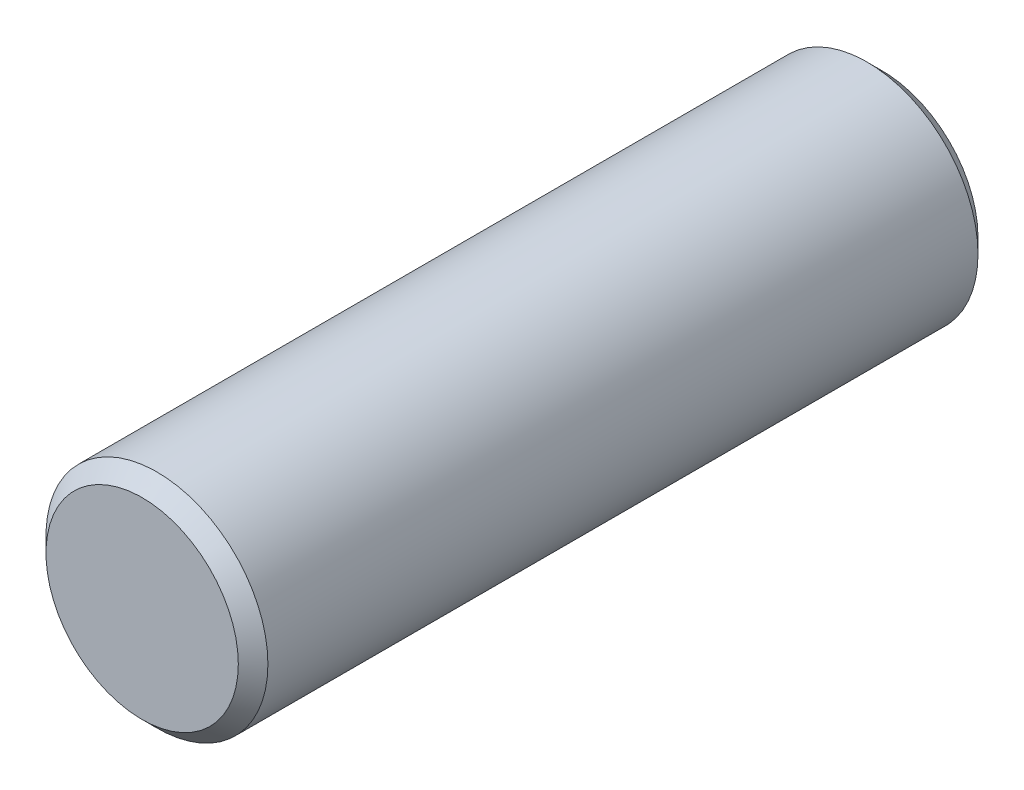
ISO-10303-21;
HEADER;
FILE_DESCRIPTION(('STEP AP214'),'2;1');
FILE_NAME('part.step','',(''),(''),'','','');
FILE_SCHEMA(('AUTOMOTIVE_DESIGN { 1 0 10303 214 1 1 1 1 }'));
ENDSEC;
DATA;
#1=APPLICATION_CONTEXT('core data for automotive mechanical design processes');
#2=APPLICATION_PROTOCOL_DEFINITION('international standard','automotive_design',2000,#1);
#3=PRODUCT_CONTEXT('',#1,'mechanical');
#4=PRODUCT('Part','Part','',(#3));
#5=PRODUCT_RELATED_PRODUCT_CATEGORY('part','',(#4));
#6=PRODUCT_DEFINITION_FORMATION('','',#4);
#7=PRODUCT_DEFINITION_CONTEXT('part definition',#1,'design');
#8=PRODUCT_DEFINITION('design','',#6,#7);
#9=PRODUCT_DEFINITION_SHAPE('','',#8);
#10=(LENGTH_UNIT() NAMED_UNIT(*) SI_UNIT(.MILLI.,.METRE.));
#11=(NAMED_UNIT(*) PLANE_ANGLE_UNIT() SI_UNIT($,.RADIAN.));
#12=(NAMED_UNIT(*) SI_UNIT($,.STERADIAN.) SOLID_ANGLE_UNIT());
#13=UNCERTAINTY_MEASURE_WITH_UNIT(LENGTH_MEASURE(1.E-05),#10,'distance_accuracy_value','');
#14=(GEOMETRIC_REPRESENTATION_CONTEXT(3) GLOBAL_UNCERTAINTY_ASSIGNED_CONTEXT((#13)) GLOBAL_UNIT_ASSIGNED_CONTEXT((#10,
#11,#12)) REPRESENTATION_CONTEXT('',''));
#15=CARTESIAN_POINT('',(0.,0.,0.));
#16=DIRECTION('',(0.,0.,1.));
#17=DIRECTION('',(1.,0.,0.));
#18=AXIS2_PLACEMENT_3D('',#15,#16,#17);
#19=CARTESIAN_POINT('',(0.,0.,10.));
#20=DIRECTION('',(0.,0.,-1.));
#21=DIRECTION('',(-1.,0.,0.));
#22=AXIS2_PLACEMENT_3D('',#19,#20,#21);
#23=CYLINDRICAL_SURFACE('',#22,1.5);
#24=CARTESIAN_POINT('',(0.,0.,0.200000000000003));
#25=DIRECTION('',(0.,0.,1.));
#26=DIRECTION('',(1.,0.,0.));
#27=AXIS2_PLACEMENT_3D('',#24,#25,#26);
#28=CIRCLE('',#27,1.5);
#29=CARTESIAN_POINT('',(1.5,0.,0.200000000000003));
#30=VERTEX_POINT('',#29);
#31=EDGE_CURVE('E27',#30,#30,#28,.T.);
#32=ORIENTED_EDGE('',*,*,#31,.T.);
#33=EDGE_LOOP('',(#32));
#34=FACE_BOUND('',#33,.T.);
#35=CARTESIAN_POINT('',(0.,0.,9.8));
#36=DIRECTION('',(0.,0.,1.));
#37=DIRECTION('',(1.,0.,0.));
#38=AXIS2_PLACEMENT_3D('',#35,#36,#37);
#39=CIRCLE('',#38,1.5);
#40=CARTESIAN_POINT('',(1.5,0.,9.8));
#41=VERTEX_POINT('',#40);
#42=EDGE_CURVE('E31',#41,#41,#39,.F.);
#43=ORIENTED_EDGE('',*,*,#42,.T.);
#44=EDGE_LOOP('',(#43));
#45=FACE_BOUND('',#44,.T.);
#46=ADVANCED_FACE('F15',(#34,#45),#23,.T.);
#47=CARTESIAN_POINT('',(0.,0.,10.));
#48=DIRECTION('',(0.,0.,1.));
#49=DIRECTION('',(1.,0.,0.));
#50=AXIS2_PLACEMENT_3D('',#47,#48,#49);
#51=PLANE('',#50);
#52=CARTESIAN_POINT('',(0.,0.,10.));
#53=DIRECTION('',(0.,0.,1.));
#54=DIRECTION('',(1.,0.,0.));
#55=AXIS2_PLACEMENT_3D('',#52,#53,#54);
#56=CIRCLE('',#55,1.3);
#57=CARTESIAN_POINT('',(1.3,0.,10.));
#58=VERTEX_POINT('',#57);
#59=EDGE_CURVE('E10',#58,#58,#56,.T.);
#60=ORIENTED_EDGE('',*,*,#59,.T.);
#61=EDGE_LOOP('',(#60));
#62=FACE_BOUND('',#61,.T.);
#63=ADVANCED_FACE('F49',(#62),#51,.T.);
#64=CARTESIAN_POINT('',(0.,0.,0.));
#65=DIRECTION('',(0.,0.,1.));
#66=DIRECTION('',(1.,0.,0.));
#67=AXIS2_PLACEMENT_3D('',#64,#65,#66);
#68=PLANE('',#67);
#69=CARTESIAN_POINT('',(0.,0.,0.));
#70=DIRECTION('',(0.,0.,1.));
#71=DIRECTION('',(1.,0.,0.));
#72=AXIS2_PLACEMENT_3D('',#69,#70,#71);
#73=CIRCLE('',#72,1.3);
#74=CARTESIAN_POINT('',(1.3,0.,0.));
#75=VERTEX_POINT('',#74);
#76=EDGE_CURVE('E23',#75,#75,#73,.F.);
#77=ORIENTED_EDGE('',*,*,#76,.T.);
#78=EDGE_LOOP('',(#77));
#79=FACE_BOUND('',#78,.T.);
#80=ADVANCED_FACE('F46',(#79),#68,.F.);
#81=CARTESIAN_POINT('',(0.,0.,0.200000000000003));
#82=DIRECTION('',(0.,0.,1.));
#83=DIRECTION('',(1.,0.,0.));
#84=AXIS2_PLACEMENT_3D('',#81,#82,#83);
#85=CONICAL_SURFACE('',#84,1.5,0.785398163397449);
#86=ORIENTED_EDGE('',*,*,#76,.F.);
#87=EDGE_LOOP('',(#86));
#88=FACE_BOUND('',#87,.T.);
#89=ORIENTED_EDGE('',*,*,#31,.F.);
#90=EDGE_LOOP('',(#89));
#91=FACE_BOUND('',#90,.T.);
#92=ADVANCED_FACE('F40',(#88,#91),#85,.T.);
#93=CARTESIAN_POINT('',(0.,0.,10.));
#94=DIRECTION('',(0.,0.,-1.));
#95=DIRECTION('',(-1.,0.,0.));
#96=AXIS2_PLACEMENT_3D('',#93,#94,#95);
#97=CONICAL_SURFACE('',#96,1.3,0.78539816339745);
#98=ORIENTED_EDGE('',*,*,#42,.F.);
#99=EDGE_LOOP('',(#98));
#100=FACE_BOUND('',#99,.T.);
#101=ORIENTED_EDGE('',*,*,#59,.F.);
#102=EDGE_LOOP('',(#101));
#103=FACE_BOUND('',#102,.T.);
#104=ADVANCED_FACE('F18',(#100,#103),#97,.T.);
#105=CLOSED_SHELL('',(#46,#63,#80,#92,#104));
#106=MANIFOLD_SOLID_BREP('B1',#105);
#107=ADVANCED_BREP_SHAPE_REPRESENTATION('',(#18,#106),#14);
#108=SHAPE_DEFINITION_REPRESENTATION(#9,#107);
ENDSEC;
END-ISO-10303-21;
